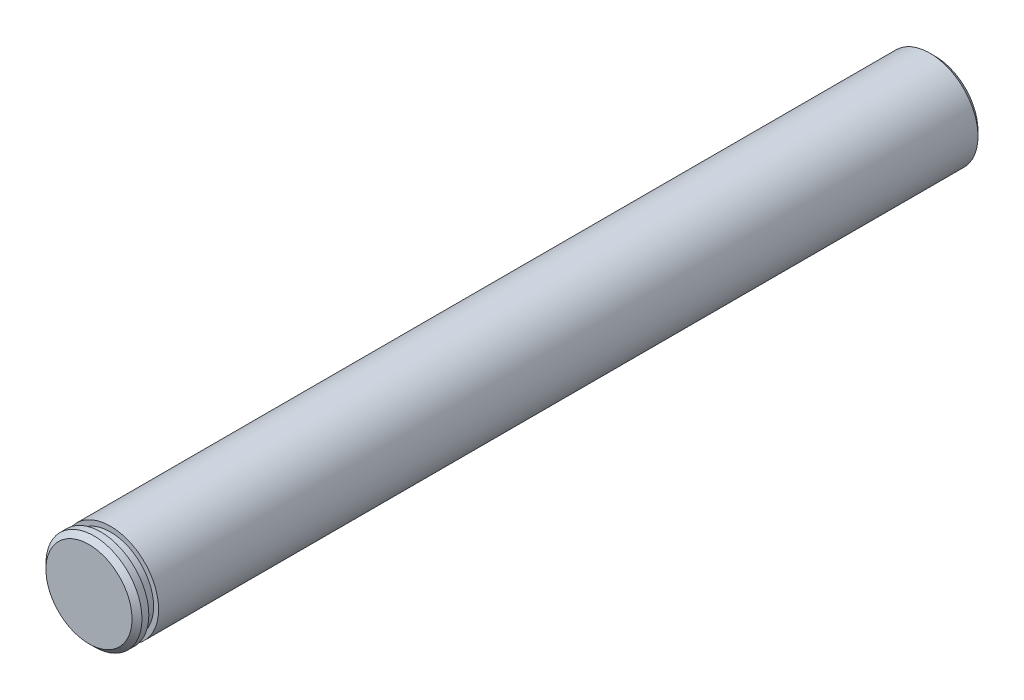
ISO-10303-21;
HEADER;
FILE_DESCRIPTION(('STEP AP214'),'2;1');
FILE_NAME('part.step','',(''),(''),'','','');
FILE_SCHEMA(('AUTOMOTIVE_DESIGN { 1 0 10303 214 1 1 1 1 }'));
ENDSEC;
DATA;
#1=APPLICATION_CONTEXT('core data for automotive mechanical design processes');
#2=APPLICATION_PROTOCOL_DEFINITION('international standard','automotive_design',2000,#1);
#3=PRODUCT_CONTEXT('',#1,'mechanical');
#4=PRODUCT('Part','Part','',(#3));
#5=PRODUCT_RELATED_PRODUCT_CATEGORY('part','',(#4));
#6=PRODUCT_DEFINITION_FORMATION('','',#4);
#7=PRODUCT_DEFINITION_CONTEXT('part definition',#1,'design');
#8=PRODUCT_DEFINITION('design','',#6,#7);
#9=PRODUCT_DEFINITION_SHAPE('','',#8);
#10=(LENGTH_UNIT() NAMED_UNIT(*) SI_UNIT(.MILLI.,.METRE.));
#11=(NAMED_UNIT(*) PLANE_ANGLE_UNIT() SI_UNIT($,.RADIAN.));
#12=(NAMED_UNIT(*) SI_UNIT($,.STERADIAN.) SOLID_ANGLE_UNIT());
#13=UNCERTAINTY_MEASURE_WITH_UNIT(LENGTH_MEASURE(1.E-05),#10,'distance_accuracy_value','');
#14=(GEOMETRIC_REPRESENTATION_CONTEXT(3) GLOBAL_UNCERTAINTY_ASSIGNED_CONTEXT((#13)) GLOBAL_UNIT_ASSIGNED_CONTEXT((#10,
#11,#12)) REPRESENTATION_CONTEXT('',''));
#15=CARTESIAN_POINT('',(0.,0.,0.));
#16=DIRECTION('',(0.,0.,1.));
#17=DIRECTION('',(1.,0.,0.));
#18=AXIS2_PLACEMENT_3D('',#15,#16,#17);
#19=CARTESIAN_POINT('',(0.,0.,85.));
#20=DIRECTION('',(0.,0.,-1.));
#21=DIRECTION('',(-1.,0.,0.));
#22=AXIS2_PLACEMENT_3D('',#19,#20,#21);
#23=CYLINDRICAL_SURFACE('',#22,4.825);
#24=CARTESIAN_POINT('',(0.,0.,0.5));
#25=DIRECTION('',(0.,0.,1.));
#26=DIRECTION('',(1.,0.,0.));
#27=AXIS2_PLACEMENT_3D('',#24,#25,#26);
#28=CIRCLE('',#27,4.825);
#29=CARTESIAN_POINT('',(4.825,0.,0.5));
#30=VERTEX_POINT('',#29);
#31=EDGE_CURVE('E52',#30,#30,#28,.T.);
#32=ORIENTED_EDGE('',*,*,#31,.T.);
#33=EDGE_LOOP('',(#32));
#34=FACE_BOUND('',#33,.T.);
#35=CARTESIAN_POINT('',(0.,0.,82.83));
#36=DIRECTION('',(0.,0.,1.));
#37=DIRECTION('',(1.,0.,0.));
#38=AXIS2_PLACEMENT_3D('',#35,#36,#37);
#39=CIRCLE('',#38,4.825);
#40=CARTESIAN_POINT('',(4.825,0.,82.83));
#41=VERTEX_POINT('',#40);
#42=EDGE_CURVE('E68',#41,#41,#39,.T.);
#43=ORIENTED_EDGE('',*,*,#42,.F.);
#44=EDGE_LOOP('',(#43));
#45=FACE_BOUND('',#44,.T.);
#46=ADVANCED_FACE('F43',(#34,#45),#23,.T.);
#47=CARTESIAN_POINT('',(0.,0.,0.));
#48=DIRECTION('',(0.,0.,1.));
#49=DIRECTION('',(1.,0.,0.));
#50=AXIS2_PLACEMENT_3D('',#47,#48,#49);
#51=PLANE('',#50);
#52=CARTESIAN_POINT('',(0.,0.,0.));
#53=DIRECTION('',(0.,0.,1.));
#54=DIRECTION('',(1.,0.,0.));
#55=AXIS2_PLACEMENT_3D('',#52,#53,#54);
#56=CIRCLE('',#55,4.325);
#57=CARTESIAN_POINT('',(4.325,0.,0.));
#58=VERTEX_POINT('',#57);
#59=EDGE_CURVE('E10',#58,#58,#56,.F.);
#60=ORIENTED_EDGE('',*,*,#59,.T.);
#61=EDGE_LOOP('',(#60));
#62=FACE_BOUND('',#61,.T.);
#63=ADVANCED_FACE('F104',(#62),#51,.F.);
#64=CARTESIAN_POINT('',(0.,0.,0.5));
#65=DIRECTION('',(0.,0.,1.));
#66=DIRECTION('',(1.,0.,0.));
#67=AXIS2_PLACEMENT_3D('',#64,#65,#66);
#68=CONICAL_SURFACE('',#67,4.825,0.785398163397446);
#69=ORIENTED_EDGE('',*,*,#59,.F.);
#70=EDGE_LOOP('',(#69));
#71=FACE_BOUND('',#70,.T.);
#72=ORIENTED_EDGE('',*,*,#31,.F.);
#73=EDGE_LOOP('',(#72));
#74=FACE_BOUND('',#73,.T.);
#75=ADVANCED_FACE('F46',(#71,#74),#68,.T.);
#76=CARTESIAN_POINT('',(-4.825,0.,82.83));
#77=DIRECTION('',(0.,0.,1.));
#78=DIRECTION('',(1.,0.,0.));
#79=AXIS2_PLACEMENT_3D('',#76,#77,#78);
#80=PLANE('',#79);
#81=ORIENTED_EDGE('',*,*,#42,.T.);
#82=EDGE_LOOP('',(#81));
#83=FACE_BOUND('',#82,.T.);
#84=CARTESIAN_POINT('',(0.,0.,82.83));
#85=DIRECTION('',(0.,0.,1.));
#86=DIRECTION('',(1.,0.,0.));
#87=AXIS2_PLACEMENT_3D('',#84,#85,#86);
#88=CIRCLE('',#87,4.325);
#89=CARTESIAN_POINT('',(4.325,0.,82.83));
#90=VERTEX_POINT('',#89);
#91=EDGE_CURVE('E72',#90,#90,#88,.T.);
#92=ORIENTED_EDGE('',*,*,#91,.F.);
#93=EDGE_LOOP('',(#92));
#94=FACE_BOUND('',#93,.T.);
#95=ADVANCED_FACE('F100',(#83,#94),#80,.T.);
#96=CARTESIAN_POINT('',(0.,0.,85.));
#97=DIRECTION('',(0.,0.,1.));
#98=DIRECTION('',(1.,0.,0.));
#99=AXIS2_PLACEMENT_3D('',#96,#97,#98);
#100=CYLINDRICAL_SURFACE('',#99,4.325);
#101=ORIENTED_EDGE('',*,*,#91,.T.);
#102=EDGE_LOOP('',(#101));
#103=FACE_BOUND('',#102,.T.);
#104=CARTESIAN_POINT('',(0.,0.,83.81));
#105=DIRECTION('',(0.,0.,1.));
#106=DIRECTION('',(1.,0.,0.));
#107=AXIS2_PLACEMENT_3D('',#104,#105,#106);
#108=CIRCLE('',#107,4.325);
#109=CARTESIAN_POINT('',(4.325,0.,83.81));
#110=VERTEX_POINT('',#109);
#111=EDGE_CURVE('E76',#110,#110,#108,.T.);
#112=ORIENTED_EDGE('',*,*,#111,.F.);
#113=EDGE_LOOP('',(#112));
#114=FACE_BOUND('',#113,.T.);
#115=ADVANCED_FACE('F90',(#103,#114),#100,.T.);
#116=CARTESIAN_POINT('',(-4.825,0.,83.81));
#117=DIRECTION('',(0.,0.,-1.));
#118=DIRECTION('',(-1.,0.,0.));
#119=AXIS2_PLACEMENT_3D('',#116,#117,#118);
#120=PLANE('',#119);
#121=ORIENTED_EDGE('',*,*,#111,.T.);
#122=EDGE_LOOP('',(#121));
#123=FACE_BOUND('',#122,.T.);
#124=CARTESIAN_POINT('',(0.,0.,83.81));
#125=DIRECTION('',(0.,0.,1.));
#126=DIRECTION('',(1.,0.,0.));
#127=AXIS2_PLACEMENT_3D('',#124,#125,#126);
#128=CIRCLE('',#127,4.825);
#129=CARTESIAN_POINT('',(4.825,0.,83.81));
#130=VERTEX_POINT('',#129);
#131=EDGE_CURVE('E80',#130,#130,#128,.T.);
#132=ORIENTED_EDGE('',*,*,#131,.F.);
#133=EDGE_LOOP('',(#132));
#134=FACE_BOUND('',#133,.T.);
#135=ADVANCED_FACE('F87',(#123,#134),#120,.T.);
#136=CARTESIAN_POINT('',(0.,0.,85.));
#137=DIRECTION('',(0.,0.,1.));
#138=DIRECTION('',(1.,0.,0.));
#139=AXIS2_PLACEMENT_3D('',#136,#137,#138);
#140=PLANE('',#139);
#141=CARTESIAN_POINT('',(0.,0.,85.));
#142=DIRECTION('',(0.,0.,1.));
#143=DIRECTION('',(1.,0.,0.));
#144=AXIS2_PLACEMENT_3D('',#141,#142,#143);
#145=CIRCLE('',#144,4.325);
#146=CARTESIAN_POINT('',(4.325,0.,85.));
#147=VERTEX_POINT('',#146);
#148=EDGE_CURVE('E62',#147,#147,#145,.T.);
#149=ORIENTED_EDGE('',*,*,#148,.T.);
#150=EDGE_LOOP('',(#149));
#151=FACE_BOUND('',#150,.T.);
#152=ADVANCED_FACE('F89',(#151),#140,.T.);
#153=CARTESIAN_POINT('',(0.,0.,85.));
#154=DIRECTION('',(0.,0.,-1.));
#155=DIRECTION('',(-1.,0.,0.));
#156=AXIS2_PLACEMENT_3D('',#153,#154,#155);
#157=CONICAL_SURFACE('',#156,4.325,0.785398163397432);
#158=CARTESIAN_POINT('',(0.,0.,84.5));
#159=DIRECTION('',(0.,0.,1.));
#160=DIRECTION('',(1.,0.,0.));
#161=AXIS2_PLACEMENT_3D('',#158,#159,#160);
#162=CIRCLE('',#161,4.825);
#163=CARTESIAN_POINT('',(4.825,0.,84.5));
#164=VERTEX_POINT('',#163);
#165=EDGE_CURVE('E57',#164,#164,#162,.F.);
#166=ORIENTED_EDGE('',*,*,#165,.F.);
#167=EDGE_LOOP('',(#166));
#168=FACE_BOUND('',#167,.T.);
#169=ORIENTED_EDGE('',*,*,#148,.F.);
#170=EDGE_LOOP('',(#169));
#171=FACE_BOUND('',#170,.T.);
#172=ADVANCED_FACE('F97',(#168,#171),#157,.T.);
#173=ORIENTED_EDGE('',*,*,#165,.T.);
#174=EDGE_LOOP('',(#173));
#175=FACE_BOUND('',#174,.T.);
#176=ORIENTED_EDGE('',*,*,#131,.T.);
#177=EDGE_LOOP('',(#176));
#178=FACE_BOUND('',#177,.T.);
#179=ADVANCED_FACE('F85',(#175,#178),#23,.T.);
#180=CLOSED_SHELL('',(#46,#63,#75,#95,#115,#135,#152,#172,#179));
#181=MANIFOLD_SOLID_BREP('B2',#180);
#182=ADVANCED_BREP_SHAPE_REPRESENTATION('',(#18,#181),#14);
#183=SHAPE_DEFINITION_REPRESENTATION(#9,#182);
ENDSEC;
END-ISO-10303-21;
